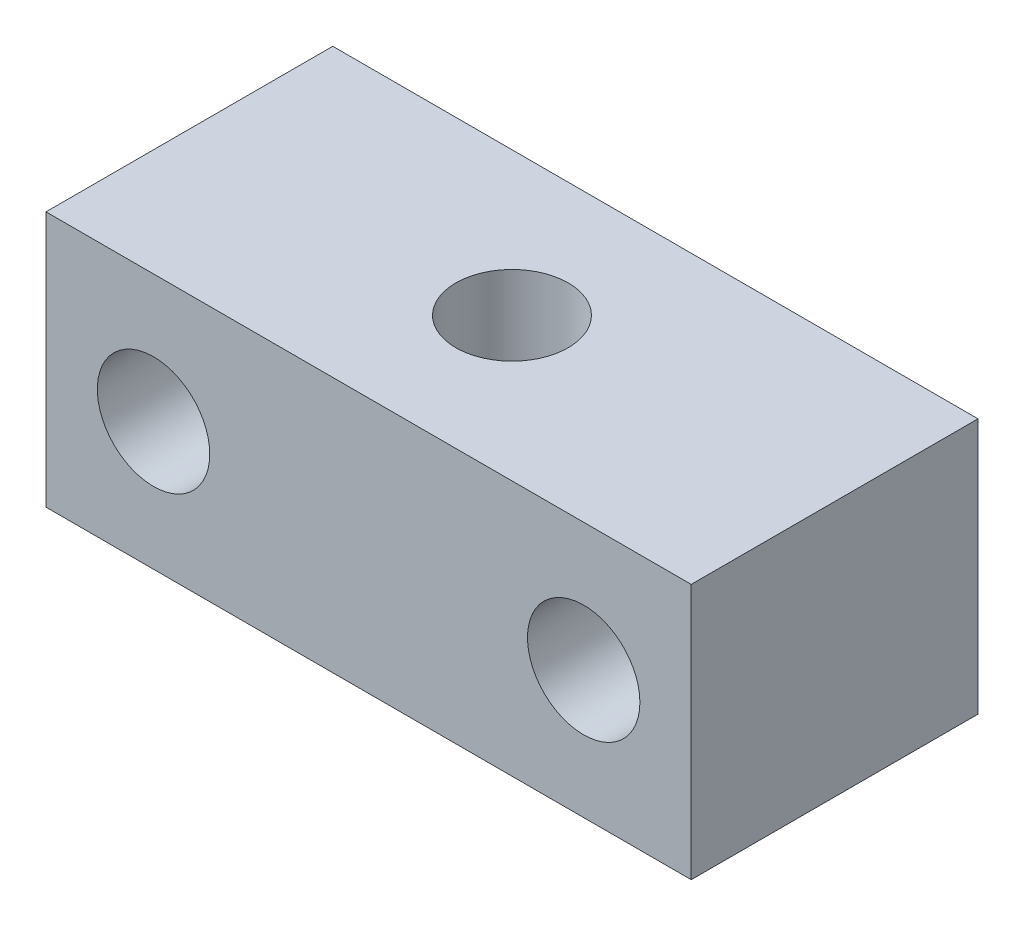
ISO-10303-21;
HEADER;
FILE_DESCRIPTION(('STEP AP214'),'2;1');
FILE_NAME('part.step','',(''),(''),'','','');
FILE_SCHEMA(('AUTOMOTIVE_DESIGN { 1 0 10303 214 1 1 1 1 }'));
ENDSEC;
DATA;
#1=APPLICATION_CONTEXT('core data for automotive mechanical design processes');
#2=APPLICATION_PROTOCOL_DEFINITION('international standard','automotive_design',2000,#1);
#3=PRODUCT_CONTEXT('',#1,'mechanical');
#4=PRODUCT('Part','Part','',(#3));
#5=PRODUCT_RELATED_PRODUCT_CATEGORY('part','',(#4));
#6=PRODUCT_DEFINITION_FORMATION('','',#4);
#7=PRODUCT_DEFINITION_CONTEXT('part definition',#1,'design');
#8=PRODUCT_DEFINITION('design','',#6,#7);
#9=PRODUCT_DEFINITION_SHAPE('','',#8);
#10=(LENGTH_UNIT() NAMED_UNIT(*) SI_UNIT(.MILLI.,.METRE.));
#11=(NAMED_UNIT(*) PLANE_ANGLE_UNIT() SI_UNIT($,.RADIAN.));
#12=(NAMED_UNIT(*) SI_UNIT($,.STERADIAN.) SOLID_ANGLE_UNIT());
#13=UNCERTAINTY_MEASURE_WITH_UNIT(LENGTH_MEASURE(1.E-05),#10,'distance_accuracy_value','');
#14=(GEOMETRIC_REPRESENTATION_CONTEXT(3) GLOBAL_UNCERTAINTY_ASSIGNED_CONTEXT((#13)) GLOBAL_UNIT_ASSIGNED_CONTEXT((#10,
#11,#12)) REPRESENTATION_CONTEXT('',''));
#15=CARTESIAN_POINT('',(0.,0.,0.));
#16=DIRECTION('',(0.,0.,1.));
#17=DIRECTION('',(1.,0.,0.));
#18=AXIS2_PLACEMENT_3D('',#15,#16,#17);
#19=CARTESIAN_POINT('',(0.,0.,6.35));
#20=DIRECTION('',(0.,0.,1.));
#21=DIRECTION('',(1.,0.,0.));
#22=AXIS2_PLACEMENT_3D('',#19,#20,#21);
#23=PLANE('',#22);
#24=CARTESIAN_POINT('',(-9.525,0.,6.35));
#25=DIRECTION('',(0.,0.,1.));
#26=DIRECTION('',(1.,0.,0.));
#27=AXIS2_PLACEMENT_3D('',#24,#25,#26);
#28=CIRCLE('',#27,2.4892);
#29=CARTESIAN_POINT('',(-7.0358,0.,6.35));
#30=VERTEX_POINT('',#29);
#31=EDGE_CURVE('E119',#30,#30,#28,.T.);
#32=ORIENTED_EDGE('',*,*,#31,.F.);
#33=EDGE_LOOP('',(#32));
#34=FACE_BOUND('',#33,.T.);
#35=DIRECTION('',(0.,-1.,0.));
#36=VECTOR('',#35,1.);
#37=CARTESIAN_POINT('',(-14.2875,-5.6642,6.35));
#38=LINE('',#37,#36);
#39=CARTESIAN_POINT('',(-14.2875,5.6642,6.35));
#40=VERTEX_POINT('',#39);
#41=CARTESIAN_POINT('',(-14.2875,-5.6642,6.35));
#42=VERTEX_POINT('',#41);
#43=EDGE_CURVE('E97',#40,#42,#38,.T.);
#44=ORIENTED_EDGE('',*,*,#43,.T.);
#45=DIRECTION('',(1.,0.,0.));
#46=VECTOR('',#45,1.);
#47=CARTESIAN_POINT('',(-9.525,-5.6642,6.35));
#48=LINE('',#47,#46);
#49=CARTESIAN_POINT('',(14.2875,-5.6642,6.35));
#50=VERTEX_POINT('',#49);
#51=EDGE_CURVE('E91',#42,#50,#48,.T.);
#52=ORIENTED_EDGE('',*,*,#51,.T.);
#53=DIRECTION('',(0.,1.,0.));
#54=VECTOR('',#53,1.);
#55=CARTESIAN_POINT('',(14.2875,-5.6642,6.35));
#56=LINE('',#55,#54);
#57=CARTESIAN_POINT('',(14.2875,5.6642,6.35));
#58=VERTEX_POINT('',#57);
#59=EDGE_CURVE('E94',#50,#58,#56,.T.);
#60=ORIENTED_EDGE('',*,*,#59,.T.);
#61=DIRECTION('',(-1.,0.,0.));
#62=VECTOR('',#61,1.);
#63=CARTESIAN_POINT('',(9.525,5.66419999999999,6.35));
#64=LINE('',#63,#62);
#65=EDGE_CURVE('E63',#58,#40,#64,.T.);
#66=ORIENTED_EDGE('',*,*,#65,.T.);
#67=EDGE_LOOP('',(#44,#52,#60,#66));
#68=FACE_BOUND('',#67,.T.);
#69=CARTESIAN_POINT('',(9.525,0.,6.35));
#70=DIRECTION('',(0.,0.,1.));
#71=DIRECTION('',(1.,0.,0.));
#72=AXIS2_PLACEMENT_3D('',#69,#70,#71);
#73=CIRCLE('',#72,2.4892);
#74=CARTESIAN_POINT('',(12.0142,0.,6.35));
#75=VERTEX_POINT('',#74);
#76=EDGE_CURVE('E138',#75,#75,#73,.T.);
#77=ORIENTED_EDGE('',*,*,#76,.F.);
#78=EDGE_LOOP('',(#77));
#79=FACE_BOUND('',#78,.T.);
#80=ADVANCED_FACE('F45',(#34,#68,#79),#23,.T.);
#81=CARTESIAN_POINT('',(0.,0.,-6.35));
#82=DIRECTION('',(0.,0.,1.));
#83=DIRECTION('',(1.,0.,0.));
#84=AXIS2_PLACEMENT_3D('',#81,#82,#83);
#85=PLANE('',#84);
#86=DIRECTION('',(0.,-1.,0.));
#87=VECTOR('',#86,1.);
#88=CARTESIAN_POINT('',(-14.2875,-5.6642,-6.35));
#89=LINE('',#88,#87);
#90=CARTESIAN_POINT('',(-14.2875,5.6642,-6.35));
#91=VERTEX_POINT('',#90);
#92=CARTESIAN_POINT('',(-14.2875,-5.6642,-6.35));
#93=VERTEX_POINT('',#92);
#94=EDGE_CURVE('E115',#91,#93,#89,.T.);
#95=ORIENTED_EDGE('',*,*,#94,.F.);
#96=DIRECTION('',(-1.,0.,0.));
#97=VECTOR('',#96,1.);
#98=CARTESIAN_POINT('',(-9.52500000000001,5.66419999999999,-6.35));
#99=LINE('',#98,#97);
#100=CARTESIAN_POINT('',(14.2875,5.6642,-6.35));
#101=VERTEX_POINT('',#100);
#102=EDGE_CURVE('E80',#101,#91,#99,.T.);
#103=ORIENTED_EDGE('',*,*,#102,.F.);
#104=DIRECTION('',(0.,1.,0.));
#105=VECTOR('',#104,1.);
#106=CARTESIAN_POINT('',(14.2875,-5.6642,-6.35));
#107=LINE('',#106,#105);
#108=CARTESIAN_POINT('',(14.2875,-5.6642,-6.35));
#109=VERTEX_POINT('',#108);
#110=EDGE_CURVE('E122',#109,#101,#107,.T.);
#111=ORIENTED_EDGE('',*,*,#110,.F.);
#112=DIRECTION('',(1.,0.,0.));
#113=VECTOR('',#112,1.);
#114=CARTESIAN_POINT('',(9.525,-5.66419999999999,-6.35));
#115=LINE('',#114,#113);
#116=EDGE_CURVE('E103',#93,#109,#115,.T.);
#117=ORIENTED_EDGE('',*,*,#116,.F.);
#118=EDGE_LOOP('',(#95,#103,#111,#117));
#119=FACE_BOUND('',#118,.T.);
#120=CARTESIAN_POINT('',(-9.525,0.,-6.35));
#121=DIRECTION('',(0.,0.,1.));
#122=DIRECTION('',(1.,0.,0.));
#123=AXIS2_PLACEMENT_3D('',#120,#121,#122);
#124=CIRCLE('',#123,2.4892);
#125=CARTESIAN_POINT('',(-7.0358,0.,-6.35));
#126=VERTEX_POINT('',#125);
#127=EDGE_CURVE('E134',#126,#126,#124,.T.);
#128=ORIENTED_EDGE('',*,*,#127,.T.);
#129=EDGE_LOOP('',(#128));
#130=FACE_BOUND('',#129,.T.);
#131=CARTESIAN_POINT('',(9.525,0.,-6.35));
#132=DIRECTION('',(0.,0.,1.));
#133=DIRECTION('',(1.,0.,0.));
#134=AXIS2_PLACEMENT_3D('',#131,#132,#133);
#135=CIRCLE('',#134,2.4892);
#136=CARTESIAN_POINT('',(12.0142,0.,-6.35));
#137=VERTEX_POINT('',#136);
#138=EDGE_CURVE('E142',#137,#137,#135,.T.);
#139=ORIENTED_EDGE('',*,*,#138,.T.);
#140=EDGE_LOOP('',(#139));
#141=FACE_BOUND('',#140,.T.);
#142=ADVANCED_FACE('F179',(#119,#130,#141),#85,.F.);
#143=CARTESIAN_POINT('',(-14.2875,-5.6642,6.35));
#144=DIRECTION('',(1.,0.,0.));
#145=DIRECTION('',(0.,0.,-1.));
#146=AXIS2_PLACEMENT_3D('',#143,#144,#145);
#147=PLANE('',#146);
#148=ORIENTED_EDGE('',*,*,#94,.T.);
#149=DIRECTION('',(0.,0.,-1.));
#150=VECTOR('',#149,1.);
#151=CARTESIAN_POINT('',(-14.2875,-5.6642,6.35));
#152=LINE('',#151,#150);
#153=EDGE_CURVE('E11',#42,#93,#152,.T.);
#154=ORIENTED_EDGE('',*,*,#153,.F.);
#155=ORIENTED_EDGE('',*,*,#43,.F.);
#156=DIRECTION('',(0.,0.,-1.));
#157=VECTOR('',#156,1.);
#158=CARTESIAN_POINT('',(-14.2875,5.6642,6.35));
#159=LINE('',#158,#157);
#160=EDGE_CURVE('E111',#40,#91,#159,.T.);
#161=ORIENTED_EDGE('',*,*,#160,.T.);
#162=EDGE_LOOP('',(#148,#154,#155,#161));
#163=FACE_BOUND('',#162,.T.);
#164=ADVANCED_FACE('F47',(#163),#147,.F.);
#165=CARTESIAN_POINT('',(9.525,-5.66419999999999,6.35));
#166=DIRECTION('',(0.,1.,0.));
#167=DIRECTION('',(-1.,0.,0.));
#168=AXIS2_PLACEMENT_3D('',#165,#166,#167);
#169=PLANE('',#168);
#170=CARTESIAN_POINT('',(0.,-5.6642,0.));
#171=DIRECTION('',(0.,1.,0.));
#172=DIRECTION('',(-1.,0.,0.));
#173=AXIS2_PLACEMENT_3D('',#170,#171,#172);
#174=CIRCLE('',#173,2.4892);
#175=CARTESIAN_POINT('',(-2.48919999999999,-5.6642,0.));
#176=VERTEX_POINT('',#175);
#177=EDGE_CURVE('E146',#176,#176,#174,.T.);
#178=ORIENTED_EDGE('',*,*,#177,.T.);
#179=EDGE_LOOP('',(#178));
#180=FACE_BOUND('',#179,.T.);
#181=ORIENTED_EDGE('',*,*,#116,.T.);
#182=DIRECTION('',(0.,0.,-1.));
#183=VECTOR('',#182,1.);
#184=CARTESIAN_POINT('',(14.2875,-5.6642,6.35));
#185=LINE('',#184,#183);
#186=EDGE_CURVE('E55',#50,#109,#185,.T.);
#187=ORIENTED_EDGE('',*,*,#186,.F.);
#188=ORIENTED_EDGE('',*,*,#51,.F.);
#189=ORIENTED_EDGE('',*,*,#153,.T.);
#190=EDGE_LOOP('',(#181,#187,#188,#189));
#191=FACE_BOUND('',#190,.T.);
#192=ADVANCED_FACE('F102',(#180,#191),#169,.F.);
#193=CARTESIAN_POINT('',(14.2875,-5.6642,6.35));
#194=DIRECTION('',(-1.,0.,0.));
#195=DIRECTION('',(0.,0.,1.));
#196=AXIS2_PLACEMENT_3D('',#193,#194,#195);
#197=PLANE('',#196);
#198=ORIENTED_EDGE('',*,*,#110,.T.);
#199=DIRECTION('',(0.,0.,-1.));
#200=VECTOR('',#199,1.);
#201=CARTESIAN_POINT('',(14.2875,5.6642,6.35));
#202=LINE('',#201,#200);
#203=EDGE_CURVE('E106',#58,#101,#202,.T.);
#204=ORIENTED_EDGE('',*,*,#203,.F.);
#205=ORIENTED_EDGE('',*,*,#59,.F.);
#206=ORIENTED_EDGE('',*,*,#186,.T.);
#207=EDGE_LOOP('',(#198,#204,#205,#206));
#208=FACE_BOUND('',#207,.T.);
#209=ADVANCED_FACE('F107',(#208),#197,.F.);
#210=CARTESIAN_POINT('',(-9.52500000000001,5.66419999999999,6.35));
#211=DIRECTION('',(0.,-1.,0.));
#212=DIRECTION('',(1.,0.,0.));
#213=AXIS2_PLACEMENT_3D('',#210,#211,#212);
#214=PLANE('',#213);
#215=CARTESIAN_POINT('',(0.,5.66419999999998,0.));
#216=DIRECTION('',(0.,1.,0.));
#217=DIRECTION('',(-1.,0.,0.));
#218=AXIS2_PLACEMENT_3D('',#215,#216,#217);
#219=CIRCLE('',#218,2.4892);
#220=CARTESIAN_POINT('',(-2.48919999999999,5.66419999999998,0.));
#221=VERTEX_POINT('',#220);
#222=EDGE_CURVE('E150',#221,#221,#219,.T.);
#223=ORIENTED_EDGE('',*,*,#222,.F.);
#224=EDGE_LOOP('',(#223));
#225=FACE_BOUND('',#224,.T.);
#226=ORIENTED_EDGE('',*,*,#102,.T.);
#227=ORIENTED_EDGE('',*,*,#160,.F.);
#228=ORIENTED_EDGE('',*,*,#65,.F.);
#229=ORIENTED_EDGE('',*,*,#203,.T.);
#230=EDGE_LOOP('',(#226,#227,#228,#229));
#231=FACE_BOUND('',#230,.T.);
#232=ADVANCED_FACE('F130',(#225,#231),#214,.F.);
#233=CARTESIAN_POINT('',(-9.525,0.,6.35));
#234=DIRECTION('',(0.,0.,-1.));
#235=DIRECTION('',(-1.,0.,0.));
#236=AXIS2_PLACEMENT_3D('',#233,#234,#235);
#237=CYLINDRICAL_SURFACE('',#236,2.4892);
#238=ORIENTED_EDGE('',*,*,#31,.T.);
#239=EDGE_LOOP('',(#238));
#240=FACE_BOUND('',#239,.T.);
#241=ORIENTED_EDGE('',*,*,#127,.F.);
#242=EDGE_LOOP('',(#241));
#243=FACE_BOUND('',#242,.T.);
#244=ADVANCED_FACE('F167',(#240,#243),#237,.F.);
#245=CARTESIAN_POINT('',(9.525,0.,6.35));
#246=DIRECTION('',(0.,0.,-1.));
#247=DIRECTION('',(-1.,0.,0.));
#248=AXIS2_PLACEMENT_3D('',#245,#246,#247);
#249=CYLINDRICAL_SURFACE('',#248,2.4892);
#250=ORIENTED_EDGE('',*,*,#76,.T.);
#251=EDGE_LOOP('',(#250));
#252=FACE_BOUND('',#251,.T.);
#253=ORIENTED_EDGE('',*,*,#138,.F.);
#254=EDGE_LOOP('',(#253));
#255=FACE_BOUND('',#254,.T.);
#256=ADVANCED_FACE('F162',(#252,#255),#249,.F.);
#257=CARTESIAN_POINT('',(0.,-5.6642,0.));
#258=DIRECTION('',(0.,1.,0.));
#259=DIRECTION('',(-1.,0.,0.));
#260=AXIS2_PLACEMENT_3D('',#257,#258,#259);
#261=CYLINDRICAL_SURFACE('',#260,2.4892);
#262=ORIENTED_EDGE('',*,*,#177,.F.);
#263=EDGE_LOOP('',(#262));
#264=FACE_BOUND('',#263,.T.);
#265=ORIENTED_EDGE('',*,*,#222,.T.);
#266=EDGE_LOOP('',(#265));
#267=FACE_BOUND('',#266,.T.);
#268=ADVANCED_FACE('F159',(#264,#267),#261,.F.);
#269=CLOSED_SHELL('',(#80,#142,#164,#192,#209,#232,#244,#256,#268));
#270=MANIFOLD_SOLID_BREP('B2',#269);
#271=ADVANCED_BREP_SHAPE_REPRESENTATION('',(#18,#270),#14);
#272=SHAPE_DEFINITION_REPRESENTATION(#9,#271);
ENDSEC;
END-ISO-10303-21;
